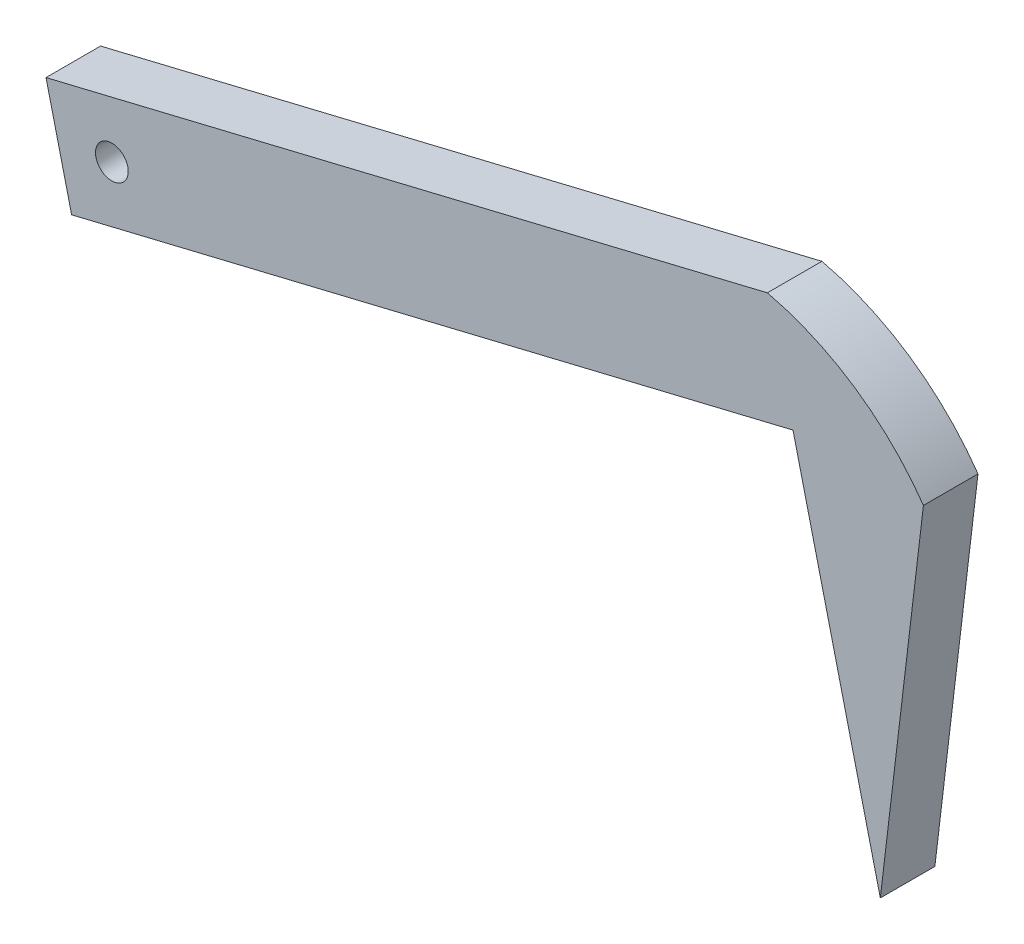
ISO-10303-21;
HEADER;
FILE_DESCRIPTION(('STEP AP214'),'2;1');
FILE_NAME('part.step','',(''),(''),'','','');
FILE_SCHEMA(('AUTOMOTIVE_DESIGN { 1 0 10303 214 1 1 1 1 }'));
ENDSEC;
DATA;
#1=APPLICATION_CONTEXT('core data for automotive mechanical design processes');
#2=APPLICATION_PROTOCOL_DEFINITION('international standard','automotive_design',2000,#1);
#3=PRODUCT_CONTEXT('',#1,'mechanical');
#4=PRODUCT('Part','Part','',(#3));
#5=PRODUCT_RELATED_PRODUCT_CATEGORY('part','',(#4));
#6=PRODUCT_DEFINITION_FORMATION('','',#4);
#7=PRODUCT_DEFINITION_CONTEXT('part definition',#1,'design');
#8=PRODUCT_DEFINITION('design','',#6,#7);
#9=PRODUCT_DEFINITION_SHAPE('','',#8);
#10=(LENGTH_UNIT() NAMED_UNIT(*) SI_UNIT(.MILLI.,.METRE.));
#11=(NAMED_UNIT(*) PLANE_ANGLE_UNIT() SI_UNIT($,.RADIAN.));
#12=(NAMED_UNIT(*) SI_UNIT($,.STERADIAN.) SOLID_ANGLE_UNIT());
#13=UNCERTAINTY_MEASURE_WITH_UNIT(LENGTH_MEASURE(1.E-05),#10,'distance_accuracy_value','');
#14=(GEOMETRIC_REPRESENTATION_CONTEXT(3) GLOBAL_UNCERTAINTY_ASSIGNED_CONTEXT((#13)) GLOBAL_UNIT_ASSIGNED_CONTEXT((#10,
#11,#12)) REPRESENTATION_CONTEXT('',''));
#15=CARTESIAN_POINT('',(0.,0.,0.));
#16=DIRECTION('',(0.,0.,1.));
#17=DIRECTION('',(1.,0.,0.));
#18=AXIS2_PLACEMENT_3D('',#15,#16,#17);
#19=CARTESIAN_POINT('',(60.4877597873812,-7.66725245526084,5.));
#20=DIRECTION('',(0.,0.,-1.));
#21=DIRECTION('',(-1.,0.,0.));
#22=AXIS2_PLACEMENT_3D('',#19,#20,#21);
#23=PLANE('',#22);
#24=DIRECTION('',(-0.972041221603923,-0.234810271288871,0.));
#25=VECTOR('',#24,1.);
#26=CARTESIAN_POINT('',(0.,0.,5.));
#27=LINE('',#26,#25);
#28=CARTESIAN_POINT('',(66.0988030690668,15.9670984476432,5.));
#29=VERTEX_POINT('',#28);
#30=CARTESIAN_POINT('',(0.,0.,5.));
#31=VERTEX_POINT('',#30);
#32=EDGE_CURVE('E129',#29,#31,#27,.T.);
#33=ORIENTED_EDGE('',*,*,#32,.T.);
#34=DIRECTION('',(0.234810271288871,-0.972041221603923,0.));
#35=VECTOR('',#34,1.);
#36=CARTESIAN_POINT('',(2.34810271288871,-9.72041221603924,5.));
#37=LINE('',#36,#35);
#38=CARTESIAN_POINT('',(2.34810271288871,-9.72041221603924,5.));
#39=VERTEX_POINT('',#38);
#40=EDGE_CURVE('E87',#31,#39,#37,.T.);
#41=ORIENTED_EDGE('',*,*,#40,.T.);
#42=DIRECTION('',(0.972041221603923,0.234810271288871,0.));
#43=VECTOR('',#42,1.);
#44=CARTESIAN_POINT('',(68.4469057819556,6.24668623160398,5.));
#45=LINE('',#44,#43);
#46=CARTESIAN_POINT('',(68.4469057819556,6.24668623160398,5.));
#47=VERTEX_POINT('',#46);
#48=EDGE_CURVE('E100',#39,#47,#45,.T.);
#49=ORIENTED_EDGE('',*,*,#48,.T.);
#50=DIRECTION('',(0.234810271288869,-0.972041221603924,0.));
#51=VECTOR('',#50,1.);
#52=CARTESIAN_POINT('',(68.4469057819556,6.24668623160398,5.));
#53=LINE('',#52,#51);
#54=CARTESIAN_POINT('',(76.4489745748551,-26.8793805375945,5.));
#55=VERTEX_POINT('',#54);
#56=EDGE_CURVE('E94',#47,#55,#53,.T.);
#57=ORIENTED_EDGE('',*,*,#56,.T.);
#58=DIRECTION('',(0.11841170203635,0.992964585884539,0.));
#59=VECTOR('',#58,1.);
#60=CARTESIAN_POINT('',(80.3992805612628,6.24668623160399,5.));
#61=LINE('',#60,#59);
#62=CARTESIAN_POINT('',(80.3992805612628,6.24668623160399,5.));
#63=VERTEX_POINT('',#62);
#64=EDGE_CURVE('E98',#55,#63,#61,.T.);
#65=ORIENTED_EDGE('',*,*,#64,.T.);
#66=CARTESIAN_POINT('',(60.4877597873812,-7.66725245526084,5.));
#67=DIRECTION('',(0.,0.,1.));
#68=DIRECTION('',(-1.,0.,0.));
#69=AXIS2_PLACEMENT_3D('',#66,#67,#68);
#70=CIRCLE('',#69,24.2912813435304);
#71=EDGE_CURVE('E50',#63,#29,#70,.T.);
#72=ORIENTED_EDGE('',*,*,#71,.T.);
#73=EDGE_LOOP('',(#33,#41,#49,#57,#65,#72));
#74=FACE_BOUND('',#73,.T.);
#75=CARTESIAN_POINT('',(6.03425746446392,-3.68615475157527,5.));
#76=DIRECTION('',(0.,0.,1.));
#77=DIRECTION('',(1.,0.,0.));
#78=AXIS2_PLACEMENT_3D('',#75,#76,#77);
#79=CIRCLE('',#78,1.5);
#80=CARTESIAN_POINT('',(7.53425746446392,-3.68615475157527,5.));
#81=VERTEX_POINT('',#80);
#82=EDGE_CURVE('E122',#81,#81,#79,.T.);
#83=ORIENTED_EDGE('',*,*,#82,.F.);
#84=EDGE_LOOP('',(#83));
#85=FACE_BOUND('',#84,.T.);
#86=ADVANCED_FACE('F33',(#74,#85),#23,.F.);
#87=CARTESIAN_POINT('',(60.4877597873812,-7.66725245526084,0.));
#88=DIRECTION('',(0.,0.,-1.));
#89=DIRECTION('',(-1.,0.,0.));
#90=AXIS2_PLACEMENT_3D('',#87,#88,#89);
#91=PLANE('',#90);
#92=DIRECTION('',(-0.972041221603923,-0.234810271288871,0.));
#93=VECTOR('',#92,1.);
#94=CARTESIAN_POINT('',(0.,0.,0.));
#95=LINE('',#94,#93);
#96=CARTESIAN_POINT('',(66.0988030690668,15.9670984476432,0.));
#97=VERTEX_POINT('',#96);
#98=CARTESIAN_POINT('',(0.,0.,0.));
#99=VERTEX_POINT('',#98);
#100=EDGE_CURVE('E118',#97,#99,#95,.T.);
#101=ORIENTED_EDGE('',*,*,#100,.F.);
#102=CARTESIAN_POINT('',(60.4877597873812,-7.66725245526084,0.));
#103=DIRECTION('',(0.,0.,1.));
#104=DIRECTION('',(-1.,0.,0.));
#105=AXIS2_PLACEMENT_3D('',#102,#103,#104);
#106=CIRCLE('',#105,24.2912813435304);
#107=CARTESIAN_POINT('',(80.3992805612628,6.24668623160399,0.));
#108=VERTEX_POINT('',#107);
#109=EDGE_CURVE('E79',#108,#97,#106,.T.);
#110=ORIENTED_EDGE('',*,*,#109,.F.);
#111=DIRECTION('',(0.11841170203635,0.992964585884539,0.));
#112=VECTOR('',#111,1.);
#113=CARTESIAN_POINT('',(80.3992805612628,6.24668623160399,0.));
#114=LINE('',#113,#112);
#115=CARTESIAN_POINT('',(76.4489745748551,-26.8793805375945,0.));
#116=VERTEX_POINT('',#115);
#117=EDGE_CURVE('E73',#116,#108,#114,.T.);
#118=ORIENTED_EDGE('',*,*,#117,.F.);
#119=DIRECTION('',(0.234810271288869,-0.972041221603924,0.));
#120=VECTOR('',#119,1.);
#121=CARTESIAN_POINT('',(68.4469057819556,6.24668623160398,0.));
#122=LINE('',#121,#120);
#123=CARTESIAN_POINT('',(68.4469057819556,6.24668623160398,0.));
#124=VERTEX_POINT('',#123);
#125=EDGE_CURVE('E108',#124,#116,#122,.T.);
#126=ORIENTED_EDGE('',*,*,#125,.F.);
#127=DIRECTION('',(0.972041221603923,0.234810271288871,0.));
#128=VECTOR('',#127,1.);
#129=CARTESIAN_POINT('',(68.4469057819556,6.24668623160398,0.));
#130=LINE('',#129,#128);
#131=CARTESIAN_POINT('',(2.34810271288871,-9.72041221603924,0.));
#132=VERTEX_POINT('',#131);
#133=EDGE_CURVE('E124',#132,#124,#130,.T.);
#134=ORIENTED_EDGE('',*,*,#133,.F.);
#135=DIRECTION('',(0.234810271288871,-0.972041221603923,0.));
#136=VECTOR('',#135,1.);
#137=CARTESIAN_POINT('',(2.34810271288871,-9.72041221603924,0.));
#138=LINE('',#137,#136);
#139=EDGE_CURVE('E121',#99,#132,#138,.T.);
#140=ORIENTED_EDGE('',*,*,#139,.F.);
#141=EDGE_LOOP('',(#101,#110,#118,#126,#134,#140));
#142=FACE_BOUND('',#141,.T.);
#143=CARTESIAN_POINT('',(6.03425746446392,-3.68615475157527,0.));
#144=DIRECTION('',(0.,0.,1.));
#145=DIRECTION('',(1.,0.,0.));
#146=AXIS2_PLACEMENT_3D('',#143,#144,#145);
#147=CIRCLE('',#146,1.5);
#148=CARTESIAN_POINT('',(7.53425746446392,-3.68615475157527,0.));
#149=VERTEX_POINT('',#148);
#150=EDGE_CURVE('E222',#149,#149,#147,.T.);
#151=ORIENTED_EDGE('',*,*,#150,.T.);
#152=EDGE_LOOP('',(#151));
#153=FACE_BOUND('',#152,.T.);
#154=ADVANCED_FACE('F138',(#142,#153),#91,.T.);
#155=CARTESIAN_POINT('',(0.,0.,5.));
#156=DIRECTION('',(0.234810271288871,-0.972041221603923,0.));
#157=DIRECTION('',(0.972041221603923,0.234810271288871,0.));
#158=AXIS2_PLACEMENT_3D('',#155,#156,#157);
#159=PLANE('',#158);
#160=ORIENTED_EDGE('',*,*,#100,.T.);
#161=DIRECTION('',(0.,0.,-1.));
#162=VECTOR('',#161,1.);
#163=CARTESIAN_POINT('',(0.,0.,5.));
#164=LINE('',#163,#162);
#165=EDGE_CURVE('E11',#31,#99,#164,.T.);
#166=ORIENTED_EDGE('',*,*,#165,.F.);
#167=ORIENTED_EDGE('',*,*,#32,.F.);
#168=DIRECTION('',(0.,0.,-1.));
#169=VECTOR('',#168,1.);
#170=CARTESIAN_POINT('',(66.0988030690668,15.9670984476432,5.));
#171=LINE('',#170,#169);
#172=EDGE_CURVE('E114',#29,#97,#171,.T.);
#173=ORIENTED_EDGE('',*,*,#172,.T.);
#174=EDGE_LOOP('',(#160,#166,#167,#173));
#175=FACE_BOUND('',#174,.T.);
#176=ADVANCED_FACE('F35',(#175),#159,.F.);
#177=CARTESIAN_POINT('',(2.34810271288871,-9.72041221603924,5.));
#178=DIRECTION('',(0.972041221603923,0.234810271288871,0.));
#179=DIRECTION('',(-0.234810271288871,0.972041221603923,0.));
#180=AXIS2_PLACEMENT_3D('',#177,#178,#179);
#181=PLANE('',#180);
#182=ORIENTED_EDGE('',*,*,#139,.T.);
#183=DIRECTION('',(0.,0.,-1.));
#184=VECTOR('',#183,1.);
#185=CARTESIAN_POINT('',(2.34810271288871,-9.72041221603924,5.));
#186=LINE('',#185,#184);
#187=EDGE_CURVE('E42',#39,#132,#186,.T.);
#188=ORIENTED_EDGE('',*,*,#187,.F.);
#189=ORIENTED_EDGE('',*,*,#40,.F.);
#190=ORIENTED_EDGE('',*,*,#165,.T.);
#191=EDGE_LOOP('',(#182,#188,#189,#190));
#192=FACE_BOUND('',#191,.T.);
#193=ADVANCED_FACE('F163',(#192),#181,.F.);
#194=CARTESIAN_POINT('',(68.4469057819556,6.24668623160398,5.));
#195=DIRECTION('',(-0.234810271288871,0.972041221603923,0.));
#196=DIRECTION('',(-0.972041221603923,-0.234810271288871,0.));
#197=AXIS2_PLACEMENT_3D('',#194,#195,#196);
#198=PLANE('',#197);
#199=ORIENTED_EDGE('',*,*,#133,.T.);
#200=DIRECTION('',(0.,0.,-1.));
#201=VECTOR('',#200,1.);
#202=CARTESIAN_POINT('',(68.4469057819556,6.24668623160398,5.));
#203=LINE('',#202,#201);
#204=EDGE_CURVE('E109',#47,#124,#203,.T.);
#205=ORIENTED_EDGE('',*,*,#204,.F.);
#206=ORIENTED_EDGE('',*,*,#48,.F.);
#207=ORIENTED_EDGE('',*,*,#187,.T.);
#208=EDGE_LOOP('',(#199,#205,#206,#207));
#209=FACE_BOUND('',#208,.T.);
#210=ADVANCED_FACE('F135',(#209),#198,.F.);
#211=CARTESIAN_POINT('',(68.4469057819556,6.24668623160398,5.));
#212=DIRECTION('',(0.972041221603924,0.234810271288869,0.));
#213=DIRECTION('',(-0.234810271288869,0.972041221603924,0.));
#214=AXIS2_PLACEMENT_3D('',#211,#212,#213);
#215=PLANE('',#214);
#216=ORIENTED_EDGE('',*,*,#125,.T.);
#217=DIRECTION('',(0.,0.,-1.));
#218=VECTOR('',#217,1.);
#219=CARTESIAN_POINT('',(76.4489745748551,-26.8793805375945,5.));
#220=LINE('',#219,#218);
#221=EDGE_CURVE('E105',#55,#116,#220,.T.);
#222=ORIENTED_EDGE('',*,*,#221,.F.);
#223=ORIENTED_EDGE('',*,*,#56,.F.);
#224=ORIENTED_EDGE('',*,*,#204,.T.);
#225=EDGE_LOOP('',(#216,#222,#223,#224));
#226=FACE_BOUND('',#225,.T.);
#227=ADVANCED_FACE('F106',(#226),#215,.F.);
#228=CARTESIAN_POINT('',(80.3992805612628,6.24668623160399,5.));
#229=DIRECTION('',(-0.99296458588454,0.11841170203635,0.));
#230=DIRECTION('',(-0.11841170203635,-0.99296458588454,0.));
#231=AXIS2_PLACEMENT_3D('',#228,#229,#230);
#232=PLANE('',#231);
#233=ORIENTED_EDGE('',*,*,#117,.T.);
#234=DIRECTION('',(0.,0.,-1.));
#235=VECTOR('',#234,1.);
#236=CARTESIAN_POINT('',(80.3992805612628,6.24668623160399,5.));
#237=LINE('',#236,#235);
#238=EDGE_CURVE('E110',#63,#108,#237,.T.);
#239=ORIENTED_EDGE('',*,*,#238,.F.);
#240=ORIENTED_EDGE('',*,*,#64,.F.);
#241=ORIENTED_EDGE('',*,*,#221,.T.);
#242=EDGE_LOOP('',(#233,#239,#240,#241));
#243=FACE_BOUND('',#242,.T.);
#244=ADVANCED_FACE('F112',(#243),#232,.F.);
#245=CARTESIAN_POINT('',(60.4877597873812,-7.66725245526084,5.));
#246=DIRECTION('',(0.,0.,-1.));
#247=DIRECTION('',(-1.,0.,0.));
#248=AXIS2_PLACEMENT_3D('',#245,#246,#247);
#249=CYLINDRICAL_SURFACE('',#248,24.2912813435304);
#250=ORIENTED_EDGE('',*,*,#109,.T.);
#251=ORIENTED_EDGE('',*,*,#172,.F.);
#252=ORIENTED_EDGE('',*,*,#71,.F.);
#253=ORIENTED_EDGE('',*,*,#238,.T.);
#254=EDGE_LOOP('',(#250,#251,#252,#253));
#255=FACE_BOUND('',#254,.T.);
#256=ADVANCED_FACE('F143',(#255),#249,.T.);
#257=CARTESIAN_POINT('',(6.03425746446392,-3.68615475157527,5.));
#258=DIRECTION('',(0.,0.,-1.));
#259=DIRECTION('',(-1.,0.,0.));
#260=AXIS2_PLACEMENT_3D('',#257,#258,#259);
#261=CYLINDRICAL_SURFACE('',#260,1.5);
#262=ORIENTED_EDGE('',*,*,#82,.T.);
#263=EDGE_LOOP('',(#262));
#264=FACE_BOUND('',#263,.T.);
#265=ORIENTED_EDGE('',*,*,#150,.F.);
#266=EDGE_LOOP('',(#265));
#267=FACE_BOUND('',#266,.T.);
#268=ADVANCED_FACE('F145',(#264,#267),#261,.F.);
#269=CLOSED_SHELL('',(#86,#154,#176,#193,#210,#227,#244,#256,#268));
#270=MANIFOLD_SOLID_BREP('B2',#269);
#271=ADVANCED_BREP_SHAPE_REPRESENTATION('',(#18,#270),#14);
#272=SHAPE_DEFINITION_REPRESENTATION(#9,#271);
ENDSEC;
END-ISO-10303-21;
